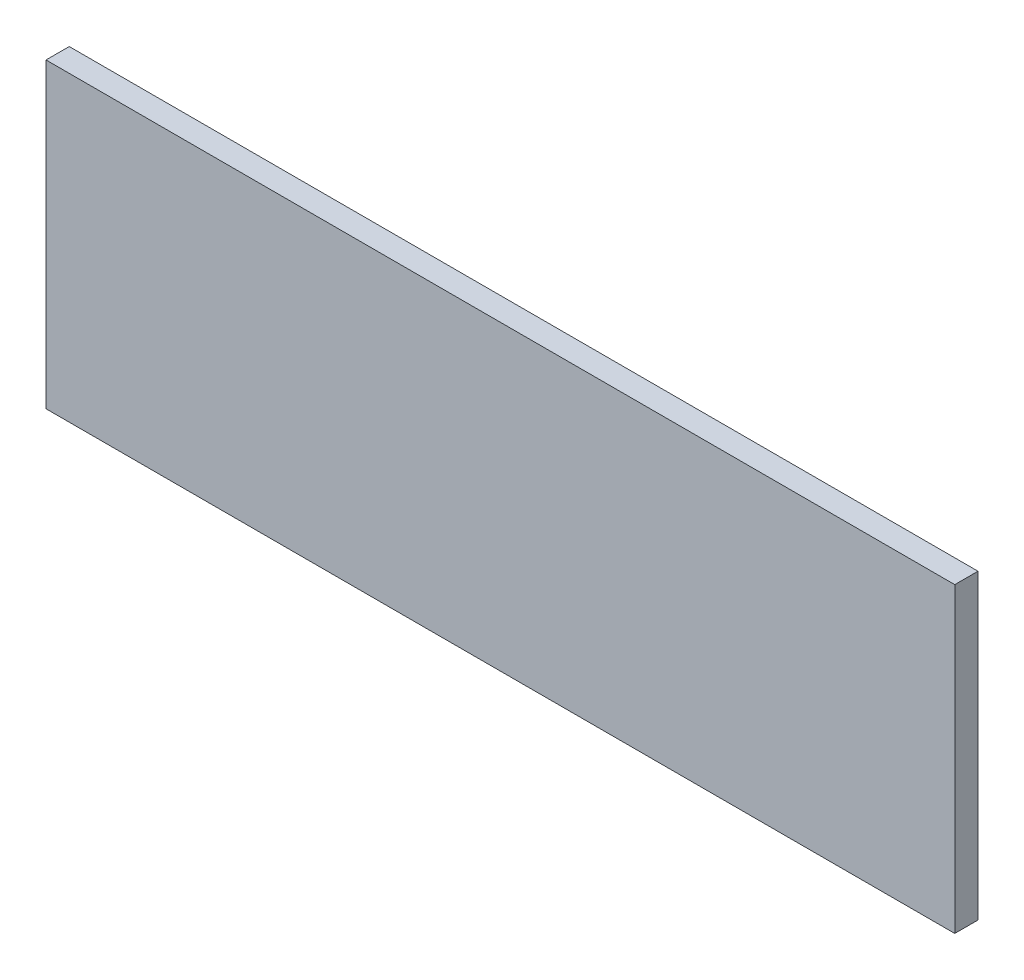
ISO-10303-21;
HEADER;
FILE_DESCRIPTION(('STEP AP214'),'2;1');
FILE_NAME('part.step','',(''),(''),'','','');
FILE_SCHEMA(('AUTOMOTIVE_DESIGN { 1 0 10303 214 1 1 1 1 }'));
ENDSEC;
DATA;
#1=APPLICATION_CONTEXT('core data for automotive mechanical design processes');
#2=APPLICATION_PROTOCOL_DEFINITION('international standard','automotive_design',2000,#1);
#3=PRODUCT_CONTEXT('',#1,'mechanical');
#4=PRODUCT('Part','Part','',(#3));
#5=PRODUCT_RELATED_PRODUCT_CATEGORY('part','',(#4));
#6=PRODUCT_DEFINITION_FORMATION('','',#4);
#7=PRODUCT_DEFINITION_CONTEXT('part definition',#1,'design');
#8=PRODUCT_DEFINITION('design','',#6,#7);
#9=PRODUCT_DEFINITION_SHAPE('','',#8);
#10=(LENGTH_UNIT() NAMED_UNIT(*) SI_UNIT(.MILLI.,.METRE.));
#11=(NAMED_UNIT(*) PLANE_ANGLE_UNIT() SI_UNIT($,.RADIAN.));
#12=(NAMED_UNIT(*) SI_UNIT($,.STERADIAN.) SOLID_ANGLE_UNIT());
#13=UNCERTAINTY_MEASURE_WITH_UNIT(LENGTH_MEASURE(1.E-05),#10,'distance_accuracy_value','');
#14=(GEOMETRIC_REPRESENTATION_CONTEXT(3) GLOBAL_UNCERTAINTY_ASSIGNED_CONTEXT((#13)) GLOBAL_UNIT_ASSIGNED_CONTEXT((#10,
#11,#12)) REPRESENTATION_CONTEXT('',''));
#15=CARTESIAN_POINT('',(0.,0.,0.));
#16=DIRECTION('',(0.,0.,1.));
#17=DIRECTION('',(1.,0.,0.));
#18=AXIS2_PLACEMENT_3D('',#15,#16,#17);
#19=CARTESIAN_POINT('',(39.12,-13.005,2.));
#20=DIRECTION('',(-1.,0.,0.));
#21=DIRECTION('',(0.,0.,1.));
#22=AXIS2_PLACEMENT_3D('',#19,#20,#21);
#23=PLANE('',#22);
#24=DIRECTION('',(0.,1.,0.));
#25=VECTOR('',#24,1.);
#26=CARTESIAN_POINT('',(39.12,-13.005,0.));
#27=LINE('',#26,#25);
#28=CARTESIAN_POINT('',(39.12,-13.005,0.));
#29=VERTEX_POINT('',#28);
#30=CARTESIAN_POINT('',(39.12,13.005,0.));
#31=VERTEX_POINT('',#30);
#32=EDGE_CURVE('E111',#29,#31,#27,.T.);
#33=ORIENTED_EDGE('',*,*,#32,.T.);
#34=DIRECTION('',(0.,0.,-1.));
#35=VECTOR('',#34,1.);
#36=CARTESIAN_POINT('',(39.12,13.005,2.));
#37=LINE('',#36,#35);
#38=CARTESIAN_POINT('',(39.12,13.005,2.));
#39=VERTEX_POINT('',#38);
#40=EDGE_CURVE('E11',#39,#31,#37,.T.);
#41=ORIENTED_EDGE('',*,*,#40,.F.);
#42=DIRECTION('',(0.,1.,0.));
#43=VECTOR('',#42,1.);
#44=CARTESIAN_POINT('',(39.12,-13.005,2.));
#45=LINE('',#44,#43);
#46=CARTESIAN_POINT('',(39.12,-13.005,2.));
#47=VERTEX_POINT('',#46);
#48=EDGE_CURVE('E95',#47,#39,#45,.T.);
#49=ORIENTED_EDGE('',*,*,#48,.F.);
#50=DIRECTION('',(0.,0.,-1.));
#51=VECTOR('',#50,1.);
#52=CARTESIAN_POINT('',(39.12,-13.005,2.));
#53=LINE('',#52,#51);
#54=EDGE_CURVE('E107',#47,#29,#53,.T.);
#55=ORIENTED_EDGE('',*,*,#54,.T.);
#56=EDGE_LOOP('',(#33,#41,#49,#55));
#57=FACE_BOUND('',#56,.T.);
#58=ADVANCED_FACE('F43',(#57),#23,.F.);
#59=CARTESIAN_POINT('',(-39.12,13.005,2.));
#60=DIRECTION('',(0.,-1.,0.));
#61=DIRECTION('',(0.,0.,-1.));
#62=AXIS2_PLACEMENT_3D('',#59,#60,#61);
#63=PLANE('',#62);
#64=DIRECTION('',(-1.,0.,0.));
#65=VECTOR('',#64,1.);
#66=CARTESIAN_POINT('',(-39.12,13.005,0.));
#67=LINE('',#66,#65);
#68=CARTESIAN_POINT('',(-39.12,13.005,0.));
#69=VERTEX_POINT('',#68);
#70=EDGE_CURVE('E100',#31,#69,#67,.T.);
#71=ORIENTED_EDGE('',*,*,#70,.T.);
#72=DIRECTION('',(0.,0.,-1.));
#73=VECTOR('',#72,1.);
#74=CARTESIAN_POINT('',(-39.12,13.005,2.));
#75=LINE('',#74,#73);
#76=CARTESIAN_POINT('',(-39.12,13.005,2.));
#77=VERTEX_POINT('',#76);
#78=EDGE_CURVE('E52',#77,#69,#75,.T.);
#79=ORIENTED_EDGE('',*,*,#78,.F.);
#80=DIRECTION('',(-1.,0.,0.));
#81=VECTOR('',#80,1.);
#82=CARTESIAN_POINT('',(-39.12,13.005,2.));
#83=LINE('',#82,#81);
#84=EDGE_CURVE('E90',#39,#77,#83,.T.);
#85=ORIENTED_EDGE('',*,*,#84,.F.);
#86=ORIENTED_EDGE('',*,*,#40,.T.);
#87=EDGE_LOOP('',(#71,#79,#85,#86));
#88=FACE_BOUND('',#87,.T.);
#89=ADVANCED_FACE('F99',(#88),#63,.F.);
#90=CARTESIAN_POINT('',(-39.12,-13.005,2.));
#91=DIRECTION('',(1.,0.,0.));
#92=DIRECTION('',(0.,0.,-1.));
#93=AXIS2_PLACEMENT_3D('',#90,#91,#92);
#94=PLANE('',#93);
#95=DIRECTION('',(0.,-1.,0.));
#96=VECTOR('',#95,1.);
#97=CARTESIAN_POINT('',(-39.12,-13.005,0.));
#98=LINE('',#97,#96);
#99=CARTESIAN_POINT('',(-39.12,-13.005,0.));
#100=VERTEX_POINT('',#99);
#101=EDGE_CURVE('E77',#69,#100,#98,.T.);
#102=ORIENTED_EDGE('',*,*,#101,.T.);
#103=DIRECTION('',(0.,0.,-1.));
#104=VECTOR('',#103,1.);
#105=CARTESIAN_POINT('',(-39.12,-13.005,2.));
#106=LINE('',#105,#104);
#107=CARTESIAN_POINT('',(-39.12,-13.005,2.));
#108=VERTEX_POINT('',#107);
#109=EDGE_CURVE('E102',#108,#100,#106,.T.);
#110=ORIENTED_EDGE('',*,*,#109,.F.);
#111=DIRECTION('',(0.,-1.,0.));
#112=VECTOR('',#111,1.);
#113=CARTESIAN_POINT('',(-39.12,-13.005,2.));
#114=LINE('',#113,#112);
#115=EDGE_CURVE('E93',#77,#108,#114,.T.);
#116=ORIENTED_EDGE('',*,*,#115,.F.);
#117=ORIENTED_EDGE('',*,*,#78,.T.);
#118=EDGE_LOOP('',(#102,#110,#116,#117));
#119=FACE_BOUND('',#118,.T.);
#120=ADVANCED_FACE('F103',(#119),#94,.F.);
#121=CARTESIAN_POINT('',(-39.12,-13.005,2.));
#122=DIRECTION('',(0.,1.,0.));
#123=DIRECTION('',(0.,0.,1.));
#124=AXIS2_PLACEMENT_3D('',#121,#122,#123);
#125=PLANE('',#124);
#126=DIRECTION('',(1.,0.,0.));
#127=VECTOR('',#126,1.);
#128=CARTESIAN_POINT('',(-39.12,-13.005,0.));
#129=LINE('',#128,#127);
#130=EDGE_CURVE('E83',#100,#29,#129,.T.);
#131=ORIENTED_EDGE('',*,*,#130,.T.);
#132=ORIENTED_EDGE('',*,*,#54,.F.);
#133=DIRECTION('',(1.,0.,0.));
#134=VECTOR('',#133,1.);
#135=CARTESIAN_POINT('',(-39.12,-13.005,2.));
#136=LINE('',#135,#134);
#137=EDGE_CURVE('E60',#108,#47,#136,.T.);
#138=ORIENTED_EDGE('',*,*,#137,.F.);
#139=ORIENTED_EDGE('',*,*,#109,.T.);
#140=EDGE_LOOP('',(#131,#132,#138,#139));
#141=FACE_BOUND('',#140,.T.);
#142=ADVANCED_FACE('F124',(#141),#125,.F.);
#143=CARTESIAN_POINT('',(0.,0.,2.));
#144=DIRECTION('',(0.,0.,-1.));
#145=DIRECTION('',(-1.,0.,0.));
#146=AXIS2_PLACEMENT_3D('',#143,#144,#145);
#147=PLANE('',#146);
#148=ORIENTED_EDGE('',*,*,#48,.T.);
#149=ORIENTED_EDGE('',*,*,#84,.T.);
#150=ORIENTED_EDGE('',*,*,#115,.T.);
#151=ORIENTED_EDGE('',*,*,#137,.T.);
#152=EDGE_LOOP('',(#148,#149,#150,#151));
#153=FACE_BOUND('',#152,.T.);
#154=ADVANCED_FACE('F91',(#153),#147,.F.);
#155=CARTESIAN_POINT('',(0.,0.,0.));
#156=DIRECTION('',(0.,0.,-1.));
#157=DIRECTION('',(-1.,0.,0.));
#158=AXIS2_PLACEMENT_3D('',#155,#156,#157);
#159=PLANE('',#158);
#160=ORIENTED_EDGE('',*,*,#32,.F.);
#161=ORIENTED_EDGE('',*,*,#130,.F.);
#162=ORIENTED_EDGE('',*,*,#101,.F.);
#163=ORIENTED_EDGE('',*,*,#70,.F.);
#164=EDGE_LOOP('',(#160,#161,#162,#163));
#165=FACE_BOUND('',#164,.T.);
#166=ADVANCED_FACE('F127',(#165),#159,.T.);
#167=CLOSED_SHELL('',(#58,#89,#120,#142,#154,#166));
#168=MANIFOLD_SOLID_BREP('B2',#167);
#169=ADVANCED_BREP_SHAPE_REPRESENTATION('',(#18,#168),#14);
#170=SHAPE_DEFINITION_REPRESENTATION(#9,#169);
ENDSEC;
END-ISO-10303-21;
